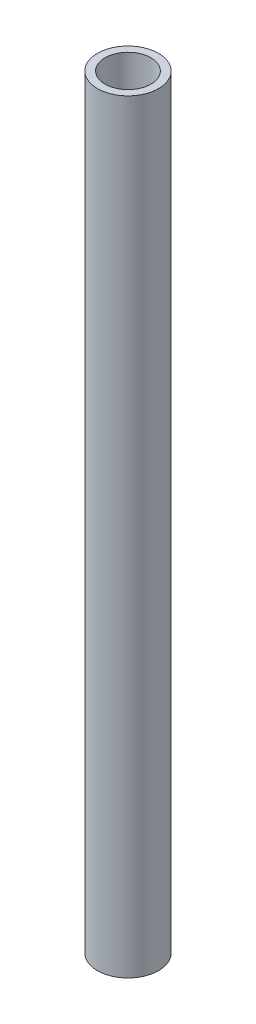
ISO-10303-21;
HEADER;
FILE_DESCRIPTION(('STEP AP214'),'2;1');
FILE_NAME('part.step','',(''),(''),'','','');
FILE_SCHEMA(('AUTOMOTIVE_DESIGN { 1 0 10303 214 1 1 1 1 }'));
ENDSEC;
DATA;
#1=APPLICATION_CONTEXT('core data for automotive mechanical design processes');
#2=APPLICATION_PROTOCOL_DEFINITION('international standard','automotive_design',2000,#1);
#3=PRODUCT_CONTEXT('',#1,'mechanical');
#4=PRODUCT('Part','Part','',(#3));
#5=PRODUCT_RELATED_PRODUCT_CATEGORY('part','',(#4));
#6=PRODUCT_DEFINITION_FORMATION('','',#4);
#7=PRODUCT_DEFINITION_CONTEXT('part definition',#1,'design');
#8=PRODUCT_DEFINITION('design','',#6,#7);
#9=PRODUCT_DEFINITION_SHAPE('','',#8);
#10=(LENGTH_UNIT() NAMED_UNIT(*) SI_UNIT(.MILLI.,.METRE.));
#11=(NAMED_UNIT(*) PLANE_ANGLE_UNIT() SI_UNIT($,.RADIAN.));
#12=(NAMED_UNIT(*) SI_UNIT($,.STERADIAN.) SOLID_ANGLE_UNIT());
#13=UNCERTAINTY_MEASURE_WITH_UNIT(LENGTH_MEASURE(1.E-05),#10,'distance_accuracy_value','');
#14=(GEOMETRIC_REPRESENTATION_CONTEXT(3) GLOBAL_UNCERTAINTY_ASSIGNED_CONTEXT((#13)) GLOBAL_UNIT_ASSIGNED_CONTEXT((#10,
#11,#12)) REPRESENTATION_CONTEXT('',''));
#15=CARTESIAN_POINT('',(0.,0.,0.));
#16=DIRECTION('',(0.,0.,1.));
#17=DIRECTION('',(1.,0.,0.));
#18=AXIS2_PLACEMENT_3D('',#15,#16,#17);
#19=CARTESIAN_POINT('',(0.,0.,0.));
#20=DIRECTION('',(0.,1.,0.));
#21=DIRECTION('',(0.,0.,1.));
#22=AXIS2_PLACEMENT_3D('',#19,#20,#21);
#23=CYLINDRICAL_SURFACE('',#22,4.);
#24=CARTESIAN_POINT('',(0.,100.,0.));
#25=DIRECTION('',(0.,1.,0.));
#26=DIRECTION('',(0.,0.,1.));
#27=AXIS2_PLACEMENT_3D('',#24,#25,#26);
#28=CIRCLE('',#27,4.);
#29=CARTESIAN_POINT('',(0.,100.,4.));
#30=VERTEX_POINT('',#29);
#31=EDGE_CURVE('E52',#30,#30,#28,.T.);
#32=ORIENTED_EDGE('',*,*,#31,.F.);
#33=EDGE_LOOP('',(#32));
#34=FACE_BOUND('',#33,.T.);
#35=CARTESIAN_POINT('',(0.,0.,0.));
#36=DIRECTION('',(0.,1.,0.));
#37=DIRECTION('',(0.,0.,1.));
#38=AXIS2_PLACEMENT_3D('',#35,#36,#37);
#39=CIRCLE('',#38,4.);
#40=CARTESIAN_POINT('',(0.,0.,4.));
#41=VERTEX_POINT('',#40);
#42=EDGE_CURVE('E37',#41,#41,#39,.T.);
#43=ORIENTED_EDGE('',*,*,#42,.T.);
#44=EDGE_LOOP('',(#43));
#45=FACE_BOUND('',#44,.T.);
#46=ADVANCED_FACE('F34',(#34,#45),#23,.T.);
#47=CARTESIAN_POINT('',(0.,0.,0.));
#48=DIRECTION('',(0.,1.,0.));
#49=DIRECTION('',(0.,0.,1.));
#50=AXIS2_PLACEMENT_3D('',#47,#48,#49);
#51=PLANE('',#50);
#52=CARTESIAN_POINT('',(0.,0.,0.));
#53=DIRECTION('',(0.,1.,0.));
#54=DIRECTION('',(0.,0.,1.));
#55=AXIS2_PLACEMENT_3D('',#52,#53,#54);
#56=CIRCLE('',#55,3.);
#57=CARTESIAN_POINT('',(0.,0.,3.));
#58=VERTEX_POINT('',#57);
#59=EDGE_CURVE('E42',#58,#58,#56,.F.);
#60=ORIENTED_EDGE('',*,*,#59,.F.);
#61=EDGE_LOOP('',(#60));
#62=FACE_BOUND('',#61,.T.);
#63=ORIENTED_EDGE('',*,*,#42,.F.);
#64=EDGE_LOOP('',(#63));
#65=FACE_BOUND('',#64,.T.);
#66=ADVANCED_FACE('F70',(#62,#65),#51,.F.);
#67=CARTESIAN_POINT('',(0.,100.,0.));
#68=DIRECTION('',(0.,1.,0.));
#69=DIRECTION('',(0.,0.,1.));
#70=AXIS2_PLACEMENT_3D('',#67,#68,#69);
#71=PLANE('',#70);
#72=CARTESIAN_POINT('',(0.,100.,0.));
#73=DIRECTION('',(0.,1.,0.));
#74=DIRECTION('',(0.,0.,1.));
#75=AXIS2_PLACEMENT_3D('',#72,#73,#74);
#76=CIRCLE('',#75,3.);
#77=CARTESIAN_POINT('',(0.,100.,3.));
#78=VERTEX_POINT('',#77);
#79=EDGE_CURVE('E11',#78,#78,#76,.F.);
#80=ORIENTED_EDGE('',*,*,#79,.T.);
#81=EDGE_LOOP('',(#80));
#82=FACE_BOUND('',#81,.T.);
#83=ORIENTED_EDGE('',*,*,#31,.T.);
#84=EDGE_LOOP('',(#83));
#85=FACE_BOUND('',#84,.T.);
#86=ADVANCED_FACE('F59',(#82,#85),#71,.T.);
#87=CARTESIAN_POINT('',(0.,0.,0.));
#88=DIRECTION('',(0.,1.,0.));
#89=DIRECTION('',(0.,0.,1.));
#90=AXIS2_PLACEMENT_3D('',#87,#88,#89);
#91=CYLINDRICAL_SURFACE('',#90,3.);
#92=ORIENTED_EDGE('',*,*,#79,.F.);
#93=EDGE_LOOP('',(#92));
#94=FACE_BOUND('',#93,.T.);
#95=ORIENTED_EDGE('',*,*,#59,.T.);
#96=EDGE_LOOP('',(#95));
#97=FACE_BOUND('',#96,.T.);
#98=ADVANCED_FACE('F62',(#94,#97),#91,.F.);
#99=CLOSED_SHELL('',(#46,#66,#86,#98));
#100=MANIFOLD_SOLID_BREP('B2',#99);
#101=ADVANCED_BREP_SHAPE_REPRESENTATION('',(#18,#100),#14);
#102=SHAPE_DEFINITION_REPRESENTATION(#9,#101);
ENDSEC;
END-ISO-10303-21;
